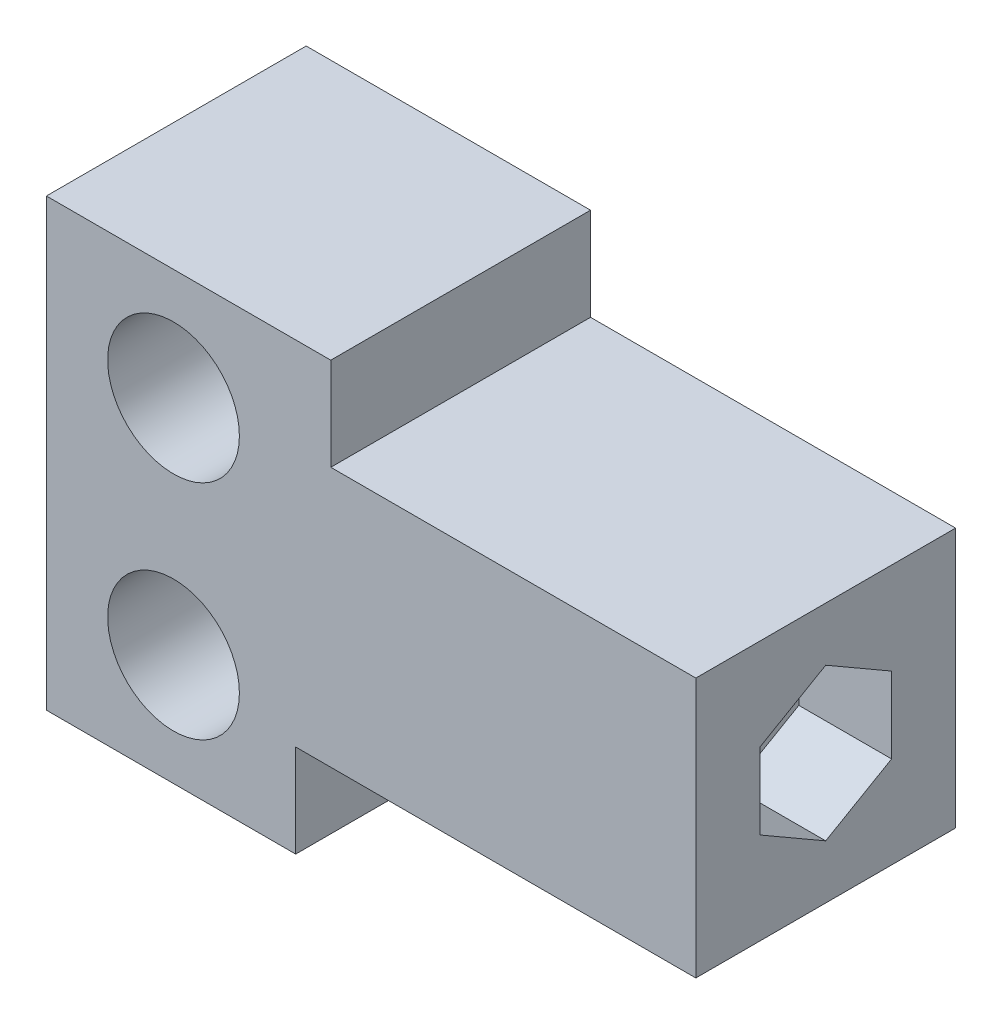
ISO-10303-21;
HEADER;
FILE_DESCRIPTION(('STEP AP214'),'2;1');
FILE_NAME('part.step','',(''),(''),'','','');
FILE_SCHEMA(('AUTOMOTIVE_DESIGN { 1 0 10303 214 1 1 1 1 }'));
ENDSEC;
DATA;
#1=APPLICATION_CONTEXT('core data for automotive mechanical design processes');
#2=APPLICATION_PROTOCOL_DEFINITION('international standard','automotive_design',2000,#1);
#3=PRODUCT_CONTEXT('',#1,'mechanical');
#4=PRODUCT('Part','Part','',(#3));
#5=PRODUCT_RELATED_PRODUCT_CATEGORY('part','',(#4));
#6=PRODUCT_DEFINITION_FORMATION('','',#4);
#7=PRODUCT_DEFINITION_CONTEXT('part definition',#1,'design');
#8=PRODUCT_DEFINITION('design','',#6,#7);
#9=PRODUCT_DEFINITION_SHAPE('','',#8);
#10=(LENGTH_UNIT() NAMED_UNIT(*) SI_UNIT(.MILLI.,.METRE.));
#11=(NAMED_UNIT(*) PLANE_ANGLE_UNIT() SI_UNIT($,.RADIAN.));
#12=(NAMED_UNIT(*) SI_UNIT($,.STERADIAN.) SOLID_ANGLE_UNIT());
#13=UNCERTAINTY_MEASURE_WITH_UNIT(LENGTH_MEASURE(1.E-05),#10,'distance_accuracy_value','');
#14=(GEOMETRIC_REPRESENTATION_CONTEXT(3) GLOBAL_UNCERTAINTY_ASSIGNED_CONTEXT((#13)) GLOBAL_UNIT_ASSIGNED_CONTEXT((#10,
#11,#12)) REPRESENTATION_CONTEXT('',''));
#15=CARTESIAN_POINT('',(0.,0.,0.));
#16=DIRECTION('',(0.,0.,1.));
#17=DIRECTION('',(1.,0.,0.));
#18=AXIS2_PLACEMENT_3D('',#15,#16,#17);
#19=CARTESIAN_POINT('',(6.85046004205248,-6.,-7.));
#20=DIRECTION('',(0.,0.,1.));
#21=DIRECTION('',(1.,0.,0.));
#22=AXIS2_PLACEMENT_3D('',#19,#20,#21);
#23=CYLINDRICAL_SURFACE('',#22,1.5);
#24=CARTESIAN_POINT('',(6.85046004205248,-6.,-7.));
#25=DIRECTION('',(0.,0.,1.));
#26=DIRECTION('',(1.,0.,0.));
#27=AXIS2_PLACEMENT_3D('',#24,#25,#26);
#28=CIRCLE('',#27,1.5);
#29=CARTESIAN_POINT('',(8.35046004205248,-6.,-7.));
#30=VERTEX_POINT('',#29);
#31=EDGE_CURVE('E257',#30,#30,#28,.T.);
#32=ORIENTED_EDGE('',*,*,#31,.F.);
#33=EDGE_LOOP('',(#32));
#34=FACE_BOUND('',#33,.T.);
#35=CARTESIAN_POINT('',(6.85046004205248,-6.,-0.999999999999997));
#36=DIRECTION('',(0.,0.,1.));
#37=DIRECTION('',(1.,0.,0.));
#38=AXIS2_PLACEMENT_3D('',#35,#36,#37);
#39=CIRCLE('',#38,1.5);
#40=CARTESIAN_POINT('',(8.35046004205248,-6.,-0.999999999999997));
#41=VERTEX_POINT('',#40);
#42=EDGE_CURVE('E37',#41,#41,#39,.F.);
#43=ORIENTED_EDGE('',*,*,#42,.F.);
#44=EDGE_LOOP('',(#43));
#45=FACE_BOUND('',#44,.T.);
#46=ADVANCED_FACE('F33',(#34,#45),#23,.F.);
#47=CARTESIAN_POINT('',(6.85046004205248,6.,-7.));
#48=DIRECTION('',(0.,0.,1.));
#49=DIRECTION('',(1.,0.,0.));
#50=AXIS2_PLACEMENT_3D('',#47,#48,#49);
#51=CYLINDRICAL_SURFACE('',#50,1.5);
#52=CARTESIAN_POINT('',(6.85046004205248,6.,-7.));
#53=DIRECTION('',(0.,0.,1.));
#54=DIRECTION('',(1.,0.,0.));
#55=AXIS2_PLACEMENT_3D('',#52,#53,#54);
#56=CIRCLE('',#55,1.5);
#57=CARTESIAN_POINT('',(8.35046004205248,6.,-7.));
#58=VERTEX_POINT('',#57);
#59=EDGE_CURVE('E163',#58,#58,#56,.T.);
#60=ORIENTED_EDGE('',*,*,#59,.F.);
#61=EDGE_LOOP('',(#60));
#62=FACE_BOUND('',#61,.T.);
#63=CARTESIAN_POINT('',(6.85046004205248,6.,-0.999999999999997));
#64=DIRECTION('',(0.,0.,1.));
#65=DIRECTION('',(1.,0.,0.));
#66=AXIS2_PLACEMENT_3D('',#63,#64,#65);
#67=CIRCLE('',#66,1.5);
#68=CARTESIAN_POINT('',(8.35046004205248,6.,-0.999999999999997));
#69=VERTEX_POINT('',#68);
#70=EDGE_CURVE('E255',#69,#69,#67,.F.);
#71=ORIENTED_EDGE('',*,*,#70,.F.);
#72=EDGE_LOOP('',(#71));
#73=FACE_BOUND('',#72,.T.);
#74=ADVANCED_FACE('F283',(#62,#73),#51,.F.);
#75=CARTESIAN_POINT('',(35.,-7.,7.));
#76=DIRECTION('',(0.,1.,0.));
#77=DIRECTION('',(0.,0.,1.));
#78=AXIS2_PLACEMENT_3D('',#75,#76,#77);
#79=PLANE('',#78);
#80=DIRECTION('',(0.,0.,1.));
#81=VECTOR('',#80,1.);
#82=CARTESIAN_POINT('',(13.4353461106012,-7.,7.));
#83=LINE('',#82,#81);
#84=CARTESIAN_POINT('',(13.4353461106012,-7.,-7.));
#85=VERTEX_POINT('',#84);
#86=CARTESIAN_POINT('',(13.4353461106012,-7.,7.));
#87=VERTEX_POINT('',#86);
#88=EDGE_CURVE('E50',#85,#87,#83,.T.);
#89=ORIENTED_EDGE('',*,*,#88,.F.);
#90=DIRECTION('',(-1.,0.,0.));
#91=VECTOR('',#90,1.);
#92=CARTESIAN_POINT('',(35.,-7.,-7.));
#93=LINE('',#92,#91);
#94=CARTESIAN_POINT('',(35.,-7.,-7.));
#95=VERTEX_POINT('',#94);
#96=EDGE_CURVE('E247',#95,#85,#93,.T.);
#97=ORIENTED_EDGE('',*,*,#96,.F.);
#98=DIRECTION('',(0.,0.,-1.));
#99=VECTOR('',#98,1.);
#100=CARTESIAN_POINT('',(35.,-7.,7.));
#101=LINE('',#100,#99);
#102=CARTESIAN_POINT('',(35.,-7.,7.));
#103=VERTEX_POINT('',#102);
#104=EDGE_CURVE('E246',#103,#95,#101,.T.);
#105=ORIENTED_EDGE('',*,*,#104,.F.);
#106=DIRECTION('',(-1.,0.,0.));
#107=VECTOR('',#106,1.);
#108=CARTESIAN_POINT('',(35.,-7.,7.));
#109=LINE('',#108,#107);
#110=EDGE_CURVE('E251',#103,#87,#109,.T.);
#111=ORIENTED_EDGE('',*,*,#110,.T.);
#112=EDGE_LOOP('',(#89,#97,#105,#111));
#113=FACE_BOUND('',#112,.T.);
#114=ADVANCED_FACE('F289',(#113),#79,.F.);
#115=CARTESIAN_POINT('',(35.,7.,7.));
#116=DIRECTION('',(0.,-1.,0.));
#117=DIRECTION('',(0.,0.,-1.));
#118=AXIS2_PLACEMENT_3D('',#115,#116,#117);
#119=PLANE('',#118);
#120=DIRECTION('',(0.,0.,-1.));
#121=VECTOR('',#120,1.);
#122=CARTESIAN_POINT('',(15.325652572443,7.,-7.));
#123=LINE('',#122,#121);
#124=CARTESIAN_POINT('',(15.325652572443,7.,7.));
#125=VERTEX_POINT('',#124);
#126=CARTESIAN_POINT('',(15.325652572443,7.,-7.));
#127=VERTEX_POINT('',#126);
#128=EDGE_CURVE('E57',#125,#127,#123,.T.);
#129=ORIENTED_EDGE('',*,*,#128,.F.);
#130=DIRECTION('',(-1.,0.,0.));
#131=VECTOR('',#130,1.);
#132=CARTESIAN_POINT('',(35.,7.,7.));
#133=LINE('',#132,#131);
#134=CARTESIAN_POINT('',(35.,7.,7.));
#135=VERTEX_POINT('',#134);
#136=EDGE_CURVE('E42',#135,#125,#133,.T.);
#137=ORIENTED_EDGE('',*,*,#136,.F.);
#138=DIRECTION('',(0.,0.,1.));
#139=VECTOR('',#138,1.);
#140=CARTESIAN_POINT('',(35.,7.,7.));
#141=LINE('',#140,#139);
#142=CARTESIAN_POINT('',(35.,7.,-7.));
#143=VERTEX_POINT('',#142);
#144=EDGE_CURVE('E242',#143,#135,#141,.T.);
#145=ORIENTED_EDGE('',*,*,#144,.F.);
#146=DIRECTION('',(-1.,0.,0.));
#147=VECTOR('',#146,1.);
#148=CARTESIAN_POINT('',(35.,7.,-7.));
#149=LINE('',#148,#147);
#150=EDGE_CURVE('E11',#143,#127,#149,.T.);
#151=ORIENTED_EDGE('',*,*,#150,.T.);
#152=EDGE_LOOP('',(#129,#137,#145,#151));
#153=FACE_BOUND('',#152,.T.);
#154=ADVANCED_FACE('F343',(#153),#119,.F.);
#155=CARTESIAN_POINT('',(35.,0.,0.));
#156=DIRECTION('',(-1.,0.,0.));
#157=DIRECTION('',(0.,0.,1.));
#158=AXIS2_PLACEMENT_3D('',#155,#156,#157);
#159=CYLINDRICAL_SURFACE('',#158,2.);
#160=CARTESIAN_POINT('',(0.,0.,0.));
#161=DIRECTION('',(-1.,0.,0.));
#162=DIRECTION('',(0.,0.,1.));
#163=AXIS2_PLACEMENT_3D('',#160,#161,#162);
#164=CIRCLE('',#163,2.);
#165=CARTESIAN_POINT('',(0.,0.,2.));
#166=VERTEX_POINT('',#165);
#167=EDGE_CURVE('E148',#166,#166,#164,.T.);
#168=ORIENTED_EDGE('',*,*,#167,.T.);
#169=EDGE_LOOP('',(#168));
#170=FACE_BOUND('',#169,.T.);
#171=CARTESIAN_POINT('',(30.,0.,0.));
#172=DIRECTION('',(1.,0.,0.));
#173=DIRECTION('',(0.,0.,-1.));
#174=AXIS2_PLACEMENT_3D('',#171,#172,#173);
#175=CIRCLE('',#174,2.);
#176=CARTESIAN_POINT('',(30.,0.,-2.));
#177=VERTEX_POINT('',#176);
#178=EDGE_CURVE('E226',#177,#177,#175,.F.);
#179=ORIENTED_EDGE('',*,*,#178,.F.);
#180=EDGE_LOOP('',(#179));
#181=FACE_BOUND('',#180,.T.);
#182=ADVANCED_FACE('F340',(#170,#181),#159,.F.);
#183=CARTESIAN_POINT('',(35.,7.,-7.));
#184=DIRECTION('',(0.,0.,1.));
#185=DIRECTION('',(0.,-1.,0.));
#186=AXIS2_PLACEMENT_3D('',#183,#184,#185);
#187=PLANE('',#186);
#188=ORIENTED_EDGE('',*,*,#31,.T.);
#189=EDGE_LOOP('',(#188));
#190=FACE_BOUND('',#189,.T.);
#191=ORIENTED_EDGE('',*,*,#59,.T.);
#192=EDGE_LOOP('',(#191));
#193=FACE_BOUND('',#192,.T.);
#194=DIRECTION('',(0.,1.,0.));
#195=VECTOR('',#194,1.);
#196=CARTESIAN_POINT('',(0.,7.,-7.));
#197=LINE('',#196,#195);
#198=CARTESIAN_POINT('',(0.,-12.,-7.));
#199=VERTEX_POINT('',#198);
#200=CARTESIAN_POINT('',(0.,12.,-7.));
#201=VERTEX_POINT('',#200);
#202=EDGE_CURVE('E137',#199,#201,#197,.T.);
#203=ORIENTED_EDGE('',*,*,#202,.T.);
#204=DIRECTION('',(-1.,0.,0.));
#205=VECTOR('',#204,1.);
#206=CARTESIAN_POINT('',(0.,12.,-7.));
#207=LINE('',#206,#205);
#208=CARTESIAN_POINT('',(15.325652572443,12.,-7.));
#209=VERTEX_POINT('',#208);
#210=EDGE_CURVE('E179',#209,#201,#207,.T.);
#211=ORIENTED_EDGE('',*,*,#210,.F.);
#212=DIRECTION('',(0.,-1.,0.));
#213=VECTOR('',#212,1.);
#214=CARTESIAN_POINT('',(15.325652572443,12.,-7.));
#215=LINE('',#214,#213);
#216=EDGE_CURVE('E181',#209,#127,#215,.T.);
#217=ORIENTED_EDGE('',*,*,#216,.T.);
#218=ORIENTED_EDGE('',*,*,#150,.F.);
#219=DIRECTION('',(0.,1.,0.));
#220=VECTOR('',#219,1.);
#221=CARTESIAN_POINT('',(35.,7.,-7.));
#222=LINE('',#221,#220);
#223=EDGE_CURVE('E239',#95,#143,#222,.T.);
#224=ORIENTED_EDGE('',*,*,#223,.F.);
#225=ORIENTED_EDGE('',*,*,#96,.T.);
#226=DIRECTION('',(0.,1.,0.));
#227=VECTOR('',#226,1.);
#228=CARTESIAN_POINT('',(13.4353461106012,-12.,-7.));
#229=LINE('',#228,#227);
#230=CARTESIAN_POINT('',(13.4353461106012,-12.,-7.));
#231=VERTEX_POINT('',#230);
#232=EDGE_CURVE('E153',#231,#85,#229,.T.);
#233=ORIENTED_EDGE('',*,*,#232,.F.);
#234=DIRECTION('',(1.,0.,0.));
#235=VECTOR('',#234,1.);
#236=CARTESIAN_POINT('',(0.,-12.,-7.));
#237=LINE('',#236,#235);
#238=EDGE_CURVE('E151',#199,#231,#237,.T.);
#239=ORIENTED_EDGE('',*,*,#238,.F.);
#240=EDGE_LOOP('',(#203,#211,#217,#218,#224,#225,#233,#239));
#241=FACE_BOUND('',#240,.T.);
#242=ADVANCED_FACE('F35',(#190,#193,#241),#187,.F.);
#243=CARTESIAN_POINT('',(35.,7.,7.));
#244=DIRECTION('',(0.,0.,-1.));
#245=DIRECTION('',(0.,1.,0.));
#246=AXIS2_PLACEMENT_3D('',#243,#244,#245);
#247=PLANE('',#246);
#248=CARTESIAN_POINT('',(6.85046004205248,-6.,7.));
#249=DIRECTION('',(0.,0.,1.));
#250=DIRECTION('',(1.,0.,0.));
#251=AXIS2_PLACEMENT_3D('',#248,#249,#250);
#252=CIRCLE('',#251,3.55);
#253=CARTESIAN_POINT('',(10.4004600420525,-6.,7.));
#254=VERTEX_POINT('',#253);
#255=EDGE_CURVE('E270',#254,#254,#252,.T.);
#256=ORIENTED_EDGE('',*,*,#255,.F.);
#257=EDGE_LOOP('',(#256));
#258=FACE_BOUND('',#257,.T.);
#259=CARTESIAN_POINT('',(6.85046004205248,6.,7.));
#260=DIRECTION('',(0.,0.,1.));
#261=DIRECTION('',(1.,0.,0.));
#262=AXIS2_PLACEMENT_3D('',#259,#260,#261);
#263=CIRCLE('',#262,3.55);
#264=CARTESIAN_POINT('',(10.4004600420525,6.,7.));
#265=VERTEX_POINT('',#264);
#266=EDGE_CURVE('E263',#265,#265,#263,.T.);
#267=ORIENTED_EDGE('',*,*,#266,.F.);
#268=EDGE_LOOP('',(#267));
#269=FACE_BOUND('',#268,.T.);
#270=DIRECTION('',(0.,-1.,0.));
#271=VECTOR('',#270,1.);
#272=CARTESIAN_POINT('',(0.,7.,7.));
#273=LINE('',#272,#271);
#274=CARTESIAN_POINT('',(0.,12.,7.));
#275=VERTEX_POINT('',#274);
#276=CARTESIAN_POINT('',(0.,-12.,7.));
#277=VERTEX_POINT('',#276);
#278=EDGE_CURVE('E147',#275,#277,#273,.T.);
#279=ORIENTED_EDGE('',*,*,#278,.T.);
#280=DIRECTION('',(-1.,0.,0.));
#281=VECTOR('',#280,1.);
#282=CARTESIAN_POINT('',(0.,-12.,7.));
#283=LINE('',#282,#281);
#284=CARTESIAN_POINT('',(13.4353461106012,-12.,7.));
#285=VERTEX_POINT('',#284);
#286=EDGE_CURVE('E161',#285,#277,#283,.T.);
#287=ORIENTED_EDGE('',*,*,#286,.F.);
#288=DIRECTION('',(0.,1.,0.));
#289=VECTOR('',#288,1.);
#290=CARTESIAN_POINT('',(13.4353461106012,-12.,7.));
#291=LINE('',#290,#289);
#292=EDGE_CURVE('E169',#285,#87,#291,.T.);
#293=ORIENTED_EDGE('',*,*,#292,.T.);
#294=ORIENTED_EDGE('',*,*,#110,.F.);
#295=DIRECTION('',(0.,-1.,0.));
#296=VECTOR('',#295,1.);
#297=CARTESIAN_POINT('',(35.,7.,7.));
#298=LINE('',#297,#296);
#299=EDGE_CURVE('E244',#135,#103,#298,.T.);
#300=ORIENTED_EDGE('',*,*,#299,.F.);
#301=ORIENTED_EDGE('',*,*,#136,.T.);
#302=DIRECTION('',(0.,-1.,0.));
#303=VECTOR('',#302,1.);
#304=CARTESIAN_POINT('',(15.325652572443,12.,7.));
#305=LINE('',#304,#303);
#306=CARTESIAN_POINT('',(15.325652572443,12.,7.));
#307=VERTEX_POINT('',#306);
#308=EDGE_CURVE('E185',#307,#125,#305,.T.);
#309=ORIENTED_EDGE('',*,*,#308,.F.);
#310=DIRECTION('',(1.,0.,0.));
#311=VECTOR('',#310,1.);
#312=CARTESIAN_POINT('',(0.,12.,7.));
#313=LINE('',#312,#311);
#314=EDGE_CURVE('E175',#275,#307,#313,.T.);
#315=ORIENTED_EDGE('',*,*,#314,.F.);
#316=EDGE_LOOP('',(#279,#287,#293,#294,#300,#301,#309,#315));
#317=FACE_BOUND('',#316,.T.);
#318=ADVANCED_FACE('F348',(#258,#269,#317),#247,.F.);
#319=CARTESIAN_POINT('',(35.,0.,0.));
#320=DIRECTION('',(1.,0.,0.));
#321=DIRECTION('',(0.,0.,-1.));
#322=AXIS2_PLACEMENT_3D('',#319,#320,#321);
#323=PLANE('',#322);
#324=DIRECTION('',(0.,0.5,-0.866025403784439));
#325=VECTOR('',#324,1.);
#326=CARTESIAN_POINT('',(35.,-4.09918691124634,0.));
#327=LINE('',#326,#325);
#328=CARTESIAN_POINT('',(35.,-4.09918691124634,0.));
#329=VERTEX_POINT('',#328);
#330=CARTESIAN_POINT('',(35.,-2.04959345562317,-3.55));
#331=VERTEX_POINT('',#330);
#332=EDGE_CURVE('E188',#329,#331,#327,.T.);
#333=ORIENTED_EDGE('',*,*,#332,.F.);
#334=DIRECTION('',(0.,-0.5,-0.866025403784439));
#335=VECTOR('',#334,1.);
#336=CARTESIAN_POINT('',(35.,-2.04959345562317,3.55));
#337=LINE('',#336,#335);
#338=CARTESIAN_POINT('',(35.,-2.04959345562317,3.55));
#339=VERTEX_POINT('',#338);
#340=EDGE_CURVE('E193',#339,#329,#337,.T.);
#341=ORIENTED_EDGE('',*,*,#340,.F.);
#342=DIRECTION('',(0.,-1.,0.));
#343=VECTOR('',#342,1.);
#344=CARTESIAN_POINT('',(35.,2.04959345562317,3.55));
#345=LINE('',#344,#343);
#346=CARTESIAN_POINT('',(35.,2.04959345562317,3.55));
#347=VERTEX_POINT('',#346);
#348=EDGE_CURVE('E219',#347,#339,#345,.T.);
#349=ORIENTED_EDGE('',*,*,#348,.F.);
#350=DIRECTION('',(0.,-0.5,0.866025403784439));
#351=VECTOR('',#350,1.);
#352=CARTESIAN_POINT('',(35.,4.09918691124634,0.));
#353=LINE('',#352,#351);
#354=CARTESIAN_POINT('',(35.,4.09918691124634,0.));
#355=VERTEX_POINT('',#354);
#356=EDGE_CURVE('E216',#355,#347,#353,.T.);
#357=ORIENTED_EDGE('',*,*,#356,.F.);
#358=DIRECTION('',(0.,0.5,0.866025403784439));
#359=VECTOR('',#358,1.);
#360=CARTESIAN_POINT('',(35.,2.04959345562317,-3.55));
#361=LINE('',#360,#359);
#362=CARTESIAN_POINT('',(35.,2.04959345562317,-3.55));
#363=VERTEX_POINT('',#362);
#364=EDGE_CURVE('E213',#363,#355,#361,.T.);
#365=ORIENTED_EDGE('',*,*,#364,.F.);
#366=DIRECTION('',(0.,1.,0.));
#367=VECTOR('',#366,1.);
#368=CARTESIAN_POINT('',(35.,-2.04959345562317,-3.55));
#369=LINE('',#368,#367);
#370=EDGE_CURVE('E210',#331,#363,#369,.T.);
#371=ORIENTED_EDGE('',*,*,#370,.F.);
#372=EDGE_LOOP('',(#333,#341,#349,#357,#365,#371));
#373=FACE_BOUND('',#372,.T.);
#374=ORIENTED_EDGE('',*,*,#223,.T.);
#375=ORIENTED_EDGE('',*,*,#144,.T.);
#376=ORIENTED_EDGE('',*,*,#299,.T.);
#377=ORIENTED_EDGE('',*,*,#104,.T.);
#378=EDGE_LOOP('',(#374,#375,#376,#377));
#379=FACE_BOUND('',#378,.T.);
#380=ADVANCED_FACE('F345',(#373,#379),#323,.T.);
#381=CARTESIAN_POINT('',(0.,0.,0.));
#382=DIRECTION('',(1.,0.,0.));
#383=DIRECTION('',(0.,0.,-1.));
#384=AXIS2_PLACEMENT_3D('',#381,#382,#383);
#385=PLANE('',#384);
#386=ORIENTED_EDGE('',*,*,#167,.F.);
#387=EDGE_LOOP('',(#386));
#388=FACE_BOUND('',#387,.T.);
#389=ORIENTED_EDGE('',*,*,#202,.F.);
#390=DIRECTION('',(0.,0.,-1.));
#391=VECTOR('',#390,1.);
#392=CARTESIAN_POINT('',(0.,-12.,7.));
#393=LINE('',#392,#391);
#394=EDGE_CURVE('E141',#277,#199,#393,.T.);
#395=ORIENTED_EDGE('',*,*,#394,.F.);
#396=ORIENTED_EDGE('',*,*,#278,.F.);
#397=DIRECTION('',(0.,0.,1.));
#398=VECTOR('',#397,1.);
#399=CARTESIAN_POINT('',(0.,12.,-7.));
#400=LINE('',#399,#398);
#401=EDGE_CURVE('E143',#201,#275,#400,.T.);
#402=ORIENTED_EDGE('',*,*,#401,.F.);
#403=EDGE_LOOP('',(#389,#395,#396,#402));
#404=FACE_BOUND('',#403,.T.);
#405=ADVANCED_FACE('F139',(#388,#404),#385,.F.);
#406=CARTESIAN_POINT('',(30.,0.,0.));
#407=DIRECTION('',(1.,0.,0.));
#408=DIRECTION('',(0.,0.,-1.));
#409=AXIS2_PLACEMENT_3D('',#406,#407,#408);
#410=PLANE('',#409);
#411=DIRECTION('',(0.,0.5,-0.866025403784439));
#412=VECTOR('',#411,1.);
#413=CARTESIAN_POINT('',(30.,-4.09918691124634,0.));
#414=LINE('',#413,#412);
#415=CARTESIAN_POINT('',(30.,-4.09918691124634,0.));
#416=VERTEX_POINT('',#415);
#417=CARTESIAN_POINT('',(30.,-2.04959345562317,-3.55));
#418=VERTEX_POINT('',#417);
#419=EDGE_CURVE('E189',#416,#418,#414,.T.);
#420=ORIENTED_EDGE('',*,*,#419,.T.);
#421=DIRECTION('',(0.,1.,0.));
#422=VECTOR('',#421,1.);
#423=CARTESIAN_POINT('',(30.,-2.04959345562317,-3.55));
#424=LINE('',#423,#422);
#425=CARTESIAN_POINT('',(30.,2.04959345562317,-3.55));
#426=VERTEX_POINT('',#425);
#427=EDGE_CURVE('E192',#418,#426,#424,.T.);
#428=ORIENTED_EDGE('',*,*,#427,.T.);
#429=DIRECTION('',(0.,0.5,0.866025403784439));
#430=VECTOR('',#429,1.);
#431=CARTESIAN_POINT('',(30.,2.04959345562317,-3.55));
#432=LINE('',#431,#430);
#433=CARTESIAN_POINT('',(30.,4.09918691124634,0.));
#434=VERTEX_POINT('',#433);
#435=EDGE_CURVE('E196',#426,#434,#432,.T.);
#436=ORIENTED_EDGE('',*,*,#435,.T.);
#437=DIRECTION('',(0.,-0.5,0.866025403784439));
#438=VECTOR('',#437,1.);
#439=CARTESIAN_POINT('',(30.,4.09918691124634,0.));
#440=LINE('',#439,#438);
#441=CARTESIAN_POINT('',(30.,2.04959345562317,3.55));
#442=VERTEX_POINT('',#441);
#443=EDGE_CURVE('E199',#434,#442,#440,.T.);
#444=ORIENTED_EDGE('',*,*,#443,.T.);
#445=DIRECTION('',(0.,-1.,0.));
#446=VECTOR('',#445,1.);
#447=CARTESIAN_POINT('',(30.,2.04959345562317,3.55));
#448=LINE('',#447,#446);
#449=CARTESIAN_POINT('',(30.,-2.04959345562317,3.55));
#450=VERTEX_POINT('',#449);
#451=EDGE_CURVE('E202',#442,#450,#448,.T.);
#452=ORIENTED_EDGE('',*,*,#451,.T.);
#453=DIRECTION('',(0.,-0.5,-0.866025403784439));
#454=VECTOR('',#453,1.);
#455=CARTESIAN_POINT('',(30.,-2.04959345562317,3.55));
#456=LINE('',#455,#454);
#457=EDGE_CURVE('E205',#450,#416,#456,.T.);
#458=ORIENTED_EDGE('',*,*,#457,.T.);
#459=EDGE_LOOP('',(#420,#428,#436,#444,#452,#458));
#460=FACE_BOUND('',#459,.T.);
#461=ORIENTED_EDGE('',*,*,#178,.T.);
#462=EDGE_LOOP('',(#461));
#463=FACE_BOUND('',#462,.T.);
#464=ADVANCED_FACE('F313',(#460,#463),#410,.T.);
#465=CARTESIAN_POINT('',(30.,-4.09918691124634,0.));
#466=DIRECTION('',(0.,-0.866025403784439,-0.5));
#467=DIRECTION('',(0.,0.5,-0.866025403784439));
#468=AXIS2_PLACEMENT_3D('',#465,#466,#467);
#469=PLANE('',#468);
#470=ORIENTED_EDGE('',*,*,#332,.T.);
#471=DIRECTION('',(1.,0.,0.));
#472=VECTOR('',#471,1.);
#473=CARTESIAN_POINT('',(30.,-2.04959345562317,-3.55));
#474=LINE('',#473,#472);
#475=EDGE_CURVE('E208',#418,#331,#474,.T.);
#476=ORIENTED_EDGE('',*,*,#475,.F.);
#477=ORIENTED_EDGE('',*,*,#419,.F.);
#478=DIRECTION('',(1.,0.,0.));
#479=VECTOR('',#478,1.);
#480=CARTESIAN_POINT('',(30.,-4.09918691124634,0.));
#481=LINE('',#480,#479);
#482=EDGE_CURVE('E224',#416,#329,#481,.T.);
#483=ORIENTED_EDGE('',*,*,#482,.T.);
#484=EDGE_LOOP('',(#470,#476,#477,#483));
#485=FACE_BOUND('',#484,.T.);
#486=ADVANCED_FACE('F316',(#485),#469,.F.);
#487=CARTESIAN_POINT('',(30.,-2.04959345562317,3.55));
#488=DIRECTION('',(0.,-0.866025403784438,0.5));
#489=DIRECTION('',(0.,-0.5,-0.866025403784438));
#490=AXIS2_PLACEMENT_3D('',#487,#488,#489);
#491=PLANE('',#490);
#492=ORIENTED_EDGE('',*,*,#340,.T.);
#493=ORIENTED_EDGE('',*,*,#482,.F.);
#494=ORIENTED_EDGE('',*,*,#457,.F.);
#495=DIRECTION('',(1.,0.,0.));
#496=VECTOR('',#495,1.);
#497=CARTESIAN_POINT('',(30.,-2.04959345562317,3.55));
#498=LINE('',#497,#496);
#499=EDGE_CURVE('E227',#450,#339,#498,.T.);
#500=ORIENTED_EDGE('',*,*,#499,.T.);
#501=EDGE_LOOP('',(#492,#493,#494,#500));
#502=FACE_BOUND('',#501,.T.);
#503=ADVANCED_FACE('F318',(#502),#491,.F.);
#504=CARTESIAN_POINT('',(30.,2.04959345562317,3.55));
#505=DIRECTION('',(0.,0.,1.));
#506=DIRECTION('',(0.,-1.,0.));
#507=AXIS2_PLACEMENT_3D('',#504,#505,#506);
#508=PLANE('',#507);
#509=ORIENTED_EDGE('',*,*,#348,.T.);
#510=ORIENTED_EDGE('',*,*,#499,.F.);
#511=ORIENTED_EDGE('',*,*,#451,.F.);
#512=DIRECTION('',(1.,0.,0.));
#513=VECTOR('',#512,1.);
#514=CARTESIAN_POINT('',(30.,2.04959345562317,3.55));
#515=LINE('',#514,#513);
#516=EDGE_CURVE('E229',#442,#347,#515,.T.);
#517=ORIENTED_EDGE('',*,*,#516,.T.);
#518=EDGE_LOOP('',(#509,#510,#511,#517));
#519=FACE_BOUND('',#518,.T.);
#520=ADVANCED_FACE('F321',(#519),#508,.F.);
#521=CARTESIAN_POINT('',(30.,4.09918691124634,0.));
#522=DIRECTION('',(0.,0.866025403784439,0.5));
#523=DIRECTION('',(0.,-0.5,0.866025403784439));
#524=AXIS2_PLACEMENT_3D('',#521,#522,#523);
#525=PLANE('',#524);
#526=ORIENTED_EDGE('',*,*,#356,.T.);
#527=ORIENTED_EDGE('',*,*,#516,.F.);
#528=ORIENTED_EDGE('',*,*,#443,.F.);
#529=DIRECTION('',(1.,0.,0.));
#530=VECTOR('',#529,1.);
#531=CARTESIAN_POINT('',(30.,4.09918691124634,0.));
#532=LINE('',#531,#530);
#533=EDGE_CURVE('E231',#434,#355,#532,.T.);
#534=ORIENTED_EDGE('',*,*,#533,.T.);
#535=EDGE_LOOP('',(#526,#527,#528,#534));
#536=FACE_BOUND('',#535,.T.);
#537=ADVANCED_FACE('F325',(#536),#525,.F.);
#538=CARTESIAN_POINT('',(30.,2.04959345562317,-3.55));
#539=DIRECTION('',(0.,0.866025403784439,-0.5));
#540=DIRECTION('',(0.,0.5,0.866025403784439));
#541=AXIS2_PLACEMENT_3D('',#538,#539,#540);
#542=PLANE('',#541);
#543=ORIENTED_EDGE('',*,*,#364,.T.);
#544=ORIENTED_EDGE('',*,*,#533,.F.);
#545=ORIENTED_EDGE('',*,*,#435,.F.);
#546=DIRECTION('',(1.,0.,0.));
#547=VECTOR('',#546,1.);
#548=CARTESIAN_POINT('',(30.,2.04959345562317,-3.55));
#549=LINE('',#548,#547);
#550=EDGE_CURVE('E233',#426,#363,#549,.T.);
#551=ORIENTED_EDGE('',*,*,#550,.T.);
#552=EDGE_LOOP('',(#543,#544,#545,#551));
#553=FACE_BOUND('',#552,.T.);
#554=ADVANCED_FACE('F329',(#553),#542,.F.);
#555=CARTESIAN_POINT('',(30.,-2.04959345562317,-3.55));
#556=DIRECTION('',(0.,0.,-1.));
#557=DIRECTION('',(-1.,0.,0.));
#558=AXIS2_PLACEMENT_3D('',#555,#556,#557);
#559=PLANE('',#558);
#560=ORIENTED_EDGE('',*,*,#370,.T.);
#561=ORIENTED_EDGE('',*,*,#550,.F.);
#562=ORIENTED_EDGE('',*,*,#427,.F.);
#563=ORIENTED_EDGE('',*,*,#475,.T.);
#564=EDGE_LOOP('',(#560,#561,#562,#563));
#565=FACE_BOUND('',#564,.T.);
#566=ADVANCED_FACE('F311',(#565),#559,.F.);
#567=CARTESIAN_POINT('',(15.325652572443,12.,-7.));
#568=DIRECTION('',(-1.,0.,0.));
#569=DIRECTION('',(0.,0.,1.));
#570=AXIS2_PLACEMENT_3D('',#567,#568,#569);
#571=PLANE('',#570);
#572=ORIENTED_EDGE('',*,*,#128,.T.);
#573=ORIENTED_EDGE('',*,*,#216,.F.);
#574=DIRECTION('',(0.,0.,-1.));
#575=VECTOR('',#574,1.);
#576=CARTESIAN_POINT('',(15.325652572443,12.,-7.));
#577=LINE('',#576,#575);
#578=EDGE_CURVE('E177',#307,#209,#577,.T.);
#579=ORIENTED_EDGE('',*,*,#578,.F.);
#580=ORIENTED_EDGE('',*,*,#308,.T.);
#581=EDGE_LOOP('',(#572,#573,#579,#580));
#582=FACE_BOUND('',#581,.T.);
#583=ADVANCED_FACE('F307',(#582),#571,.F.);
#584=CARTESIAN_POINT('',(0.,12.,0.));
#585=DIRECTION('',(0.,1.,0.));
#586=DIRECTION('',(0.,0.,1.));
#587=AXIS2_PLACEMENT_3D('',#584,#585,#586);
#588=PLANE('',#587);
#589=ORIENTED_EDGE('',*,*,#401,.T.);
#590=ORIENTED_EDGE('',*,*,#314,.T.);
#591=ORIENTED_EDGE('',*,*,#578,.T.);
#592=ORIENTED_EDGE('',*,*,#210,.T.);
#593=EDGE_LOOP('',(#589,#590,#591,#592));
#594=FACE_BOUND('',#593,.T.);
#595=ADVANCED_FACE('F303',(#594),#588,.T.);
#596=CARTESIAN_POINT('',(13.4353461106012,-12.,7.));
#597=DIRECTION('',(-1.,0.,0.));
#598=DIRECTION('',(0.,0.,1.));
#599=AXIS2_PLACEMENT_3D('',#596,#597,#598);
#600=PLANE('',#599);
#601=ORIENTED_EDGE('',*,*,#88,.T.);
#602=ORIENTED_EDGE('',*,*,#292,.F.);
#603=DIRECTION('',(0.,0.,1.));
#604=VECTOR('',#603,1.);
#605=CARTESIAN_POINT('',(13.4353461106012,-12.,7.));
#606=LINE('',#605,#604);
#607=EDGE_CURVE('E156',#231,#285,#606,.T.);
#608=ORIENTED_EDGE('',*,*,#607,.F.);
#609=ORIENTED_EDGE('',*,*,#232,.T.);
#610=EDGE_LOOP('',(#601,#602,#608,#609));
#611=FACE_BOUND('',#610,.T.);
#612=ADVANCED_FACE('F300',(#611),#600,.F.);
#613=CARTESIAN_POINT('',(0.,-12.,0.));
#614=DIRECTION('',(0.,-1.,0.));
#615=DIRECTION('',(0.,0.,-1.));
#616=AXIS2_PLACEMENT_3D('',#613,#614,#615);
#617=PLANE('',#616);
#618=ORIENTED_EDGE('',*,*,#394,.T.);
#619=ORIENTED_EDGE('',*,*,#238,.T.);
#620=ORIENTED_EDGE('',*,*,#607,.T.);
#621=ORIENTED_EDGE('',*,*,#286,.T.);
#622=EDGE_LOOP('',(#618,#619,#620,#621));
#623=FACE_BOUND('',#622,.T.);
#624=ADVANCED_FACE('F159',(#623),#617,.T.);
#625=CARTESIAN_POINT('',(6.85046004205248,6.,-0.999999999999997));
#626=DIRECTION('',(0.,0.,1.));
#627=DIRECTION('',(1.,0.,0.));
#628=AXIS2_PLACEMENT_3D('',#625,#626,#627);
#629=PLANE('',#628);
#630=CARTESIAN_POINT('',(6.85046004205248,6.,-0.999999999999997));
#631=DIRECTION('',(0.,0.,1.));
#632=DIRECTION('',(1.,0.,0.));
#633=AXIS2_PLACEMENT_3D('',#630,#631,#632);
#634=CIRCLE('',#633,3.55);
#635=CARTESIAN_POINT('',(10.4004600420525,6.,-0.999999999999997));
#636=VERTEX_POINT('',#635);
#637=EDGE_CURVE('E258',#636,#636,#634,.T.);
#638=ORIENTED_EDGE('',*,*,#637,.T.);
#639=EDGE_LOOP('',(#638));
#640=FACE_BOUND('',#639,.T.);
#641=ORIENTED_EDGE('',*,*,#70,.T.);
#642=EDGE_LOOP('',(#641));
#643=FACE_BOUND('',#642,.T.);
#644=ADVANCED_FACE('F299',(#640,#643),#629,.T.);
#645=CARTESIAN_POINT('',(6.85046004205248,6.,-0.999999999999997));
#646=DIRECTION('',(0.,0.,1.));
#647=DIRECTION('',(1.,0.,0.));
#648=AXIS2_PLACEMENT_3D('',#645,#646,#647);
#649=CYLINDRICAL_SURFACE('',#648,3.55);
#650=ORIENTED_EDGE('',*,*,#637,.F.);
#651=EDGE_LOOP('',(#650));
#652=FACE_BOUND('',#651,.T.);
#653=ORIENTED_EDGE('',*,*,#266,.T.);
#654=EDGE_LOOP('',(#653));
#655=FACE_BOUND('',#654,.T.);
#656=ADVANCED_FACE('F294',(#652,#655),#649,.F.);
#657=CARTESIAN_POINT('',(6.85046004205248,-6.,-0.999999999999997));
#658=DIRECTION('',(0.,0.,1.));
#659=DIRECTION('',(1.,0.,0.));
#660=AXIS2_PLACEMENT_3D('',#657,#658,#659);
#661=PLANE('',#660);
#662=CARTESIAN_POINT('',(6.85046004205248,-6.,-0.999999999999997));
#663=DIRECTION('',(0.,0.,1.));
#664=DIRECTION('',(1.,0.,0.));
#665=AXIS2_PLACEMENT_3D('',#662,#663,#664);
#666=CIRCLE('',#665,3.55);
#667=CARTESIAN_POINT('',(10.4004600420525,-6.,-0.999999999999997));
#668=VERTEX_POINT('',#667);
#669=EDGE_CURVE('E273',#668,#668,#666,.T.);
#670=ORIENTED_EDGE('',*,*,#669,.T.);
#671=EDGE_LOOP('',(#670));
#672=FACE_BOUND('',#671,.T.);
#673=ORIENTED_EDGE('',*,*,#42,.T.);
#674=EDGE_LOOP('',(#673));
#675=FACE_BOUND('',#674,.T.);
#676=ADVANCED_FACE('F280',(#672,#675),#661,.T.);
#677=CARTESIAN_POINT('',(6.85046004205248,-6.,-0.999999999999997));
#678=DIRECTION('',(0.,0.,1.));
#679=DIRECTION('',(1.,0.,0.));
#680=AXIS2_PLACEMENT_3D('',#677,#678,#679);
#681=CYLINDRICAL_SURFACE('',#680,3.55);
#682=ORIENTED_EDGE('',*,*,#669,.F.);
#683=EDGE_LOOP('',(#682));
#684=FACE_BOUND('',#683,.T.);
#685=ORIENTED_EDGE('',*,*,#255,.T.);
#686=EDGE_LOOP('',(#685));
#687=FACE_BOUND('',#686,.T.);
#688=ADVANCED_FACE('F446',(#684,#687),#681,.F.);
#689=CLOSED_SHELL('',(#46,#74,#114,#154,#182,#242,#318,#380,#405,#464,#486,#503,#520,#537,#554,
#566,#583,#595,#612,#624,#644,#656,#676,#688));
#690=MANIFOLD_SOLID_BREP('B2',#689);
#691=ADVANCED_BREP_SHAPE_REPRESENTATION('',(#18,#690),#14);
#692=SHAPE_DEFINITION_REPRESENTATION(#9,#691);
ENDSEC;
END-ISO-10303-21;
